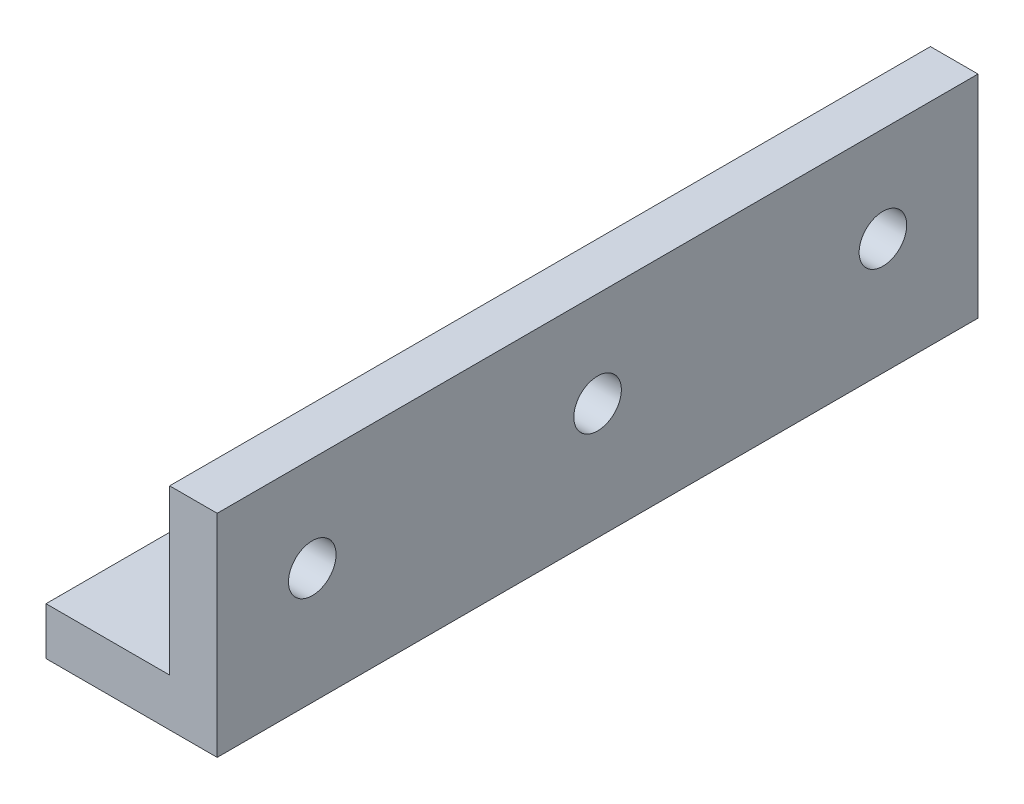
ISO-10303-21;
HEADER;
FILE_DESCRIPTION(('STEP AP214'),'2;1');
FILE_NAME('part.step','',(''),(''),'','','');
FILE_SCHEMA(('AUTOMOTIVE_DESIGN { 1 0 10303 214 1 1 1 1 }'));
ENDSEC;
DATA;
#1=APPLICATION_CONTEXT('core data for automotive mechanical design processes');
#2=APPLICATION_PROTOCOL_DEFINITION('international standard','automotive_design',2000,#1);
#3=PRODUCT_CONTEXT('',#1,'mechanical');
#4=PRODUCT('Part','Part','',(#3));
#5=PRODUCT_RELATED_PRODUCT_CATEGORY('part','',(#4));
#6=PRODUCT_DEFINITION_FORMATION('','',#4);
#7=PRODUCT_DEFINITION_CONTEXT('part definition',#1,'design');
#8=PRODUCT_DEFINITION('design','',#6,#7);
#9=PRODUCT_DEFINITION_SHAPE('','',#8);
#10=(LENGTH_UNIT() NAMED_UNIT(*) SI_UNIT(.MILLI.,.METRE.));
#11=(NAMED_UNIT(*) PLANE_ANGLE_UNIT() SI_UNIT($,.RADIAN.));
#12=(NAMED_UNIT(*) SI_UNIT($,.STERADIAN.) SOLID_ANGLE_UNIT());
#13=UNCERTAINTY_MEASURE_WITH_UNIT(LENGTH_MEASURE(1.E-05),#10,'distance_accuracy_value','');
#14=(GEOMETRIC_REPRESENTATION_CONTEXT(3) GLOBAL_UNCERTAINTY_ASSIGNED_CONTEXT((#13)) GLOBAL_UNIT_ASSIGNED_CONTEXT((#10,
#11,#12)) REPRESENTATION_CONTEXT('',''));
#15=CARTESIAN_POINT('',(0.,0.,0.));
#16=DIRECTION('',(0.,0.,1.));
#17=DIRECTION('',(1.,0.,0.));
#18=AXIS2_PLACEMENT_3D('',#15,#16,#17);
#19=CARTESIAN_POINT('',(0.,6.35,0.));
#20=DIRECTION('',(0.,-1.,0.));
#21=DIRECTION('',(0.,0.,-1.));
#22=AXIS2_PLACEMENT_3D('',#19,#20,#21);
#23=PLANE('',#22);
#24=CARTESIAN_POINT('',(24.0348534201955,6.35,10.4040716612378));
#25=DIRECTION('',(0.,1.,0.));
#26=DIRECTION('',(0.,0.,1.));
#27=AXIS2_PLACEMENT_3D('',#24,#25,#26);
#28=CIRCLE('',#27,3.175);
#29=CARTESIAN_POINT('',(24.0348534201955,6.35,13.5790716612378));
#30=VERTEX_POINT('',#29);
#31=EDGE_CURVE('E278',#30,#30,#28,.T.);
#32=ORIENTED_EDGE('',*,*,#31,.F.);
#33=EDGE_LOOP('',(#32));
#34=FACE_BOUND('',#33,.T.);
#35=CARTESIAN_POINT('',(24.0348534201955,6.35,48.5040716612378));
#36=DIRECTION('',(0.,1.,0.));
#37=DIRECTION('',(0.,0.,1.));
#38=AXIS2_PLACEMENT_3D('',#35,#36,#37);
#39=CIRCLE('',#38,3.175);
#40=CARTESIAN_POINT('',(24.0348534201955,6.35,51.6790716612378));
#41=VERTEX_POINT('',#40);
#42=EDGE_CURVE('E280',#41,#41,#39,.T.);
#43=ORIENTED_EDGE('',*,*,#42,.F.);
#44=EDGE_LOOP('',(#43));
#45=FACE_BOUND('',#44,.T.);
#46=DIRECTION('',(0.,0.,1.));
#47=VECTOR('',#46,1.);
#48=CARTESIAN_POINT('',(30.3848534201955,6.35,80.2540716612378));
#49=LINE('',#48,#47);
#50=CARTESIAN_POINT('',(30.3848534201955,6.35,-21.3459283387622));
#51=VERTEX_POINT('',#50);
#52=CARTESIAN_POINT('',(30.3848534201955,6.35,80.2540716612378));
#53=VERTEX_POINT('',#52);
#54=EDGE_CURVE('E47',#51,#53,#49,.T.);
#55=ORIENTED_EDGE('',*,*,#54,.F.);
#56=DIRECTION('',(-1.,0.,0.));
#57=VECTOR('',#56,1.);
#58=CARTESIAN_POINT('',(13.8748534201955,6.35,-21.3459283387622));
#59=LINE('',#58,#57);
#60=CARTESIAN_POINT('',(13.8748534201955,6.35,-21.3459283387622));
#61=VERTEX_POINT('',#60);
#62=EDGE_CURVE('E84',#51,#61,#59,.T.);
#63=ORIENTED_EDGE('',*,*,#62,.T.);
#64=DIRECTION('',(0.,0.,1.));
#65=VECTOR('',#64,1.);
#66=CARTESIAN_POINT('',(13.8748534201955,6.35,80.2540716612378));
#67=LINE('',#66,#65);
#68=CARTESIAN_POINT('',(13.8748534201955,6.35,80.2540716612378));
#69=VERTEX_POINT('',#68);
#70=EDGE_CURVE('E53',#61,#69,#67,.T.);
#71=ORIENTED_EDGE('',*,*,#70,.T.);
#72=DIRECTION('',(1.,0.,0.));
#73=VECTOR('',#72,1.);
#74=CARTESIAN_POINT('',(36.7348534201955,6.35,80.2540716612378));
#75=LINE('',#74,#73);
#76=EDGE_CURVE('E95',#69,#53,#75,.T.);
#77=ORIENTED_EDGE('',*,*,#76,.T.);
#78=EDGE_LOOP('',(#55,#63,#71,#77));
#79=FACE_BOUND('',#78,.T.);
#80=ADVANCED_FACE('F32',(#34,#45,#79),#23,.F.);
#81=CARTESIAN_POINT('',(13.8748534201955,6.35,-21.3459283387622));
#82=DIRECTION('',(0.,0.,1.));
#83=DIRECTION('',(1.,0.,0.));
#84=AXIS2_PLACEMENT_3D('',#81,#82,#83);
#85=PLANE('',#84);
#86=DIRECTION('',(-1.,0.,0.));
#87=VECTOR('',#86,1.);
#88=CARTESIAN_POINT('',(13.8748534201955,0.,-21.3459283387622));
#89=LINE('',#88,#87);
#90=CARTESIAN_POINT('',(36.7348534201955,0.,-21.3459283387622));
#91=VERTEX_POINT('',#90);
#92=CARTESIAN_POINT('',(13.8748534201955,0.,-21.3459283387622));
#93=VERTEX_POINT('',#92);
#94=EDGE_CURVE('E91',#91,#93,#89,.T.);
#95=ORIENTED_EDGE('',*,*,#94,.T.);
#96=DIRECTION('',(0.,-1.,0.));
#97=VECTOR('',#96,1.);
#98=CARTESIAN_POINT('',(13.8748534201955,6.35,-21.3459283387622));
#99=LINE('',#98,#97);
#100=EDGE_CURVE('E11',#61,#93,#99,.T.);
#101=ORIENTED_EDGE('',*,*,#100,.F.);
#102=ORIENTED_EDGE('',*,*,#62,.F.);
#103=DIRECTION('',(0.,-1.,0.));
#104=VECTOR('',#103,1.);
#105=CARTESIAN_POINT('',(30.3848534201955,28.23544518,-21.3459283387622));
#106=LINE('',#105,#104);
#107=CARTESIAN_POINT('',(30.3848534201955,28.23544518,-21.3459283387622));
#108=VERTEX_POINT('',#107);
#109=EDGE_CURVE('E99',#108,#51,#106,.T.);
#110=ORIENTED_EDGE('',*,*,#109,.F.);
#111=DIRECTION('',(-1.,0.,0.));
#112=VECTOR('',#111,1.);
#113=CARTESIAN_POINT('',(30.3848534201955,28.23544518,-21.3459283387622));
#114=LINE('',#113,#112);
#115=CARTESIAN_POINT('',(36.7348534201955,28.23544518,-21.3459283387622));
#116=VERTEX_POINT('',#115);
#117=EDGE_CURVE('E94',#116,#108,#114,.T.);
#118=ORIENTED_EDGE('',*,*,#117,.F.);
#119=DIRECTION('',(0.,-1.,0.));
#120=VECTOR('',#119,1.);
#121=CARTESIAN_POINT('',(36.7348534201955,6.35,-21.3459283387622));
#122=LINE('',#121,#120);
#123=EDGE_CURVE('E77',#116,#91,#122,.T.);
#124=ORIENTED_EDGE('',*,*,#123,.T.);
#125=EDGE_LOOP('',(#95,#101,#102,#110,#118,#124));
#126=FACE_BOUND('',#125,.T.);
#127=ADVANCED_FACE('F34',(#126),#85,.F.);
#128=CARTESIAN_POINT('',(13.8748534201955,6.35,80.2540716612378));
#129=DIRECTION('',(1.,0.,0.));
#130=DIRECTION('',(0.,0.,-1.));
#131=AXIS2_PLACEMENT_3D('',#128,#129,#130);
#132=PLANE('',#131);
#133=DIRECTION('',(0.,0.,1.));
#134=VECTOR('',#133,1.);
#135=CARTESIAN_POINT('',(13.8748534201955,0.,80.2540716612378));
#136=LINE('',#135,#134);
#137=CARTESIAN_POINT('',(13.8748534201955,0.,80.2540716612378));
#138=VERTEX_POINT('',#137);
#139=EDGE_CURVE('E98',#93,#138,#136,.T.);
#140=ORIENTED_EDGE('',*,*,#139,.T.);
#141=DIRECTION('',(0.,-1.,0.));
#142=VECTOR('',#141,1.);
#143=CARTESIAN_POINT('',(13.8748534201955,6.35,80.2540716612378));
#144=LINE('',#143,#142);
#145=EDGE_CURVE('E40',#69,#138,#144,.T.);
#146=ORIENTED_EDGE('',*,*,#145,.F.);
#147=ORIENTED_EDGE('',*,*,#70,.F.);
#148=ORIENTED_EDGE('',*,*,#100,.T.);
#149=EDGE_LOOP('',(#140,#146,#147,#148));
#150=FACE_BOUND('',#149,.T.);
#151=ADVANCED_FACE('F115',(#150),#132,.F.);
#152=CARTESIAN_POINT('',(36.7348534201955,6.35,80.2540716612378));
#153=DIRECTION('',(0.,0.,-1.));
#154=DIRECTION('',(-1.,0.,0.));
#155=AXIS2_PLACEMENT_3D('',#152,#153,#154);
#156=PLANE('',#155);
#157=DIRECTION('',(1.,0.,0.));
#158=VECTOR('',#157,1.);
#159=CARTESIAN_POINT('',(36.7348534201955,0.,80.2540716612378));
#160=LINE('',#159,#158);
#161=CARTESIAN_POINT('',(36.7348534201955,0.,80.2540716612378));
#162=VERTEX_POINT('',#161);
#163=EDGE_CURVE('E85',#138,#162,#160,.T.);
#164=ORIENTED_EDGE('',*,*,#163,.T.);
#165=DIRECTION('',(0.,-1.,0.));
#166=VECTOR('',#165,1.);
#167=CARTESIAN_POINT('',(36.7348534201955,6.35,80.2540716612378));
#168=LINE('',#167,#166);
#169=CARTESIAN_POINT('',(36.7348534201955,28.23544518,80.2540716612378));
#170=VERTEX_POINT('',#169);
#171=EDGE_CURVE('E80',#170,#162,#168,.T.);
#172=ORIENTED_EDGE('',*,*,#171,.F.);
#173=DIRECTION('',(1.,0.,0.));
#174=VECTOR('',#173,1.);
#175=CARTESIAN_POINT('',(36.7348534201955,28.23544518,80.2540716612378));
#176=LINE('',#175,#174);
#177=CARTESIAN_POINT('',(30.3848534201955,28.23544518,80.2540716612378));
#178=VERTEX_POINT('',#177);
#179=EDGE_CURVE('E130',#178,#170,#176,.T.);
#180=ORIENTED_EDGE('',*,*,#179,.F.);
#181=DIRECTION('',(0.,-1.,0.));
#182=VECTOR('',#181,1.);
#183=CARTESIAN_POINT('',(30.3848534201955,28.23544518,80.2540716612378));
#184=LINE('',#183,#182);
#185=EDGE_CURVE('E103',#178,#53,#184,.T.);
#186=ORIENTED_EDGE('',*,*,#185,.T.);
#187=ORIENTED_EDGE('',*,*,#76,.F.);
#188=ORIENTED_EDGE('',*,*,#145,.T.);
#189=EDGE_LOOP('',(#164,#172,#180,#186,#187,#188));
#190=FACE_BOUND('',#189,.T.);
#191=ADVANCED_FACE('F112',(#190),#156,.F.);
#192=CARTESIAN_POINT('',(36.7348534201955,6.35,-21.3459283387622));
#193=DIRECTION('',(-1.,0.,0.));
#194=DIRECTION('',(0.,0.,1.));
#195=AXIS2_PLACEMENT_3D('',#192,#193,#194);
#196=PLANE('',#195);
#197=CARTESIAN_POINT('',(36.7348534201955,15.53544518,29.4540716612378));
#198=DIRECTION('',(-1.,0.,0.));
#199=DIRECTION('',(0.,0.,1.));
#200=AXIS2_PLACEMENT_3D('',#197,#198,#199);
#201=CIRCLE('',#200,3.175);
#202=CARTESIAN_POINT('',(36.7348534201955,15.53544518,32.6290716612378));
#203=VERTEX_POINT('',#202);
#204=EDGE_CURVE('E292',#203,#203,#201,.F.);
#205=ORIENTED_EDGE('',*,*,#204,.F.);
#206=EDGE_LOOP('',(#205));
#207=FACE_BOUND('',#206,.T.);
#208=CARTESIAN_POINT('',(36.7348534201955,15.53544518,-8.64592833876222));
#209=DIRECTION('',(-1.,0.,0.));
#210=DIRECTION('',(0.,0.,1.));
#211=AXIS2_PLACEMENT_3D('',#208,#209,#210);
#212=CIRCLE('',#211,3.175);
#213=CARTESIAN_POINT('',(36.7348534201955,15.53544518,-5.47092833876222));
#214=VERTEX_POINT('',#213);
#215=EDGE_CURVE('E293',#214,#214,#212,.F.);
#216=ORIENTED_EDGE('',*,*,#215,.F.);
#217=EDGE_LOOP('',(#216));
#218=FACE_BOUND('',#217,.T.);
#219=CARTESIAN_POINT('',(36.7348534201955,15.53544518,67.5540716612378));
#220=DIRECTION('',(-1.,0.,0.));
#221=DIRECTION('',(0.,0.,1.));
#222=AXIS2_PLACEMENT_3D('',#219,#220,#221);
#223=CIRCLE('',#222,3.175);
#224=CARTESIAN_POINT('',(36.7348534201955,15.53544518,70.7290716612378));
#225=VERTEX_POINT('',#224);
#226=EDGE_CURVE('E135',#225,#225,#223,.F.);
#227=ORIENTED_EDGE('',*,*,#226,.F.);
#228=EDGE_LOOP('',(#227));
#229=FACE_BOUND('',#228,.T.);
#230=DIRECTION('',(0.,0.,-1.));
#231=VECTOR('',#230,1.);
#232=CARTESIAN_POINT('',(36.7348534201955,0.,-21.3459283387622));
#233=LINE('',#232,#231);
#234=EDGE_CURVE('E73',#162,#91,#233,.T.);
#235=ORIENTED_EDGE('',*,*,#234,.T.);
#236=ORIENTED_EDGE('',*,*,#123,.F.);
#237=DIRECTION('',(0.,0.,-1.));
#238=VECTOR('',#237,1.);
#239=CARTESIAN_POINT('',(36.7348534201955,28.23544518,-21.3459283387622));
#240=LINE('',#239,#238);
#241=EDGE_CURVE('E133',#170,#116,#240,.T.);
#242=ORIENTED_EDGE('',*,*,#241,.F.);
#243=ORIENTED_EDGE('',*,*,#171,.T.);
#244=EDGE_LOOP('',(#235,#236,#242,#243));
#245=FACE_BOUND('',#244,.T.);
#246=ADVANCED_FACE('F75',(#207,#218,#229,#245),#196,.F.);
#247=CARTESIAN_POINT('',(0.,0.,0.));
#248=DIRECTION('',(0.,-1.,0.));
#249=DIRECTION('',(0.,0.,-1.));
#250=AXIS2_PLACEMENT_3D('',#247,#248,#249);
#251=PLANE('',#250);
#252=CARTESIAN_POINT('',(24.0348534201955,0.,10.4040716612378));
#253=DIRECTION('',(0.,1.,0.));
#254=DIRECTION('',(0.,0.,1.));
#255=AXIS2_PLACEMENT_3D('',#252,#253,#254);
#256=CIRCLE('',#255,3.175);
#257=CARTESIAN_POINT('',(24.0348534201955,0.,13.5790716612378));
#258=VERTEX_POINT('',#257);
#259=EDGE_CURVE('E276',#258,#258,#256,.T.);
#260=ORIENTED_EDGE('',*,*,#259,.T.);
#261=EDGE_LOOP('',(#260));
#262=FACE_BOUND('',#261,.T.);
#263=CARTESIAN_POINT('',(24.0348534201955,0.,48.5040716612378));
#264=DIRECTION('',(0.,1.,0.));
#265=DIRECTION('',(0.,0.,1.));
#266=AXIS2_PLACEMENT_3D('',#263,#264,#265);
#267=CIRCLE('',#266,3.175);
#268=CARTESIAN_POINT('',(24.0348534201955,0.,51.6790716612378));
#269=VERTEX_POINT('',#268);
#270=EDGE_CURVE('E283',#269,#269,#267,.T.);
#271=ORIENTED_EDGE('',*,*,#270,.T.);
#272=EDGE_LOOP('',(#271));
#273=FACE_BOUND('',#272,.T.);
#274=ORIENTED_EDGE('',*,*,#94,.F.);
#275=ORIENTED_EDGE('',*,*,#234,.F.);
#276=ORIENTED_EDGE('',*,*,#163,.F.);
#277=ORIENTED_EDGE('',*,*,#139,.F.);
#278=EDGE_LOOP('',(#274,#275,#276,#277));
#279=FACE_BOUND('',#278,.T.);
#280=ADVANCED_FACE('F97',(#262,#273,#279),#251,.T.);
#281=CARTESIAN_POINT('',(30.3848534201955,28.23544518,80.2540716612378));
#282=DIRECTION('',(1.,0.,0.));
#283=DIRECTION('',(0.,0.,-1.));
#284=AXIS2_PLACEMENT_3D('',#281,#282,#283);
#285=PLANE('',#284);
#286=CARTESIAN_POINT('',(30.3848534201955,15.53544518,29.4540716612378));
#287=DIRECTION('',(-1.,0.,0.));
#288=DIRECTION('',(0.,0.,1.));
#289=AXIS2_PLACEMENT_3D('',#286,#287,#288);
#290=CIRCLE('',#289,3.175);
#291=CARTESIAN_POINT('',(30.3848534201955,15.53544518,32.6290716612378));
#292=VERTEX_POINT('',#291);
#293=EDGE_CURVE('E289',#292,#292,#290,.T.);
#294=ORIENTED_EDGE('',*,*,#293,.F.);
#295=EDGE_LOOP('',(#294));
#296=FACE_BOUND('',#295,.T.);
#297=CARTESIAN_POINT('',(30.3848534201955,15.53544518,-8.64592833876222));
#298=DIRECTION('',(-1.,0.,0.));
#299=DIRECTION('',(0.,0.,1.));
#300=AXIS2_PLACEMENT_3D('',#297,#298,#299);
#301=CIRCLE('',#300,3.175);
#302=CARTESIAN_POINT('',(30.3848534201955,15.53544518,-5.47092833876222));
#303=VERTEX_POINT('',#302);
#304=EDGE_CURVE('E286',#303,#303,#301,.T.);
#305=ORIENTED_EDGE('',*,*,#304,.F.);
#306=EDGE_LOOP('',(#305));
#307=FACE_BOUND('',#306,.T.);
#308=CARTESIAN_POINT('',(30.3848534201955,15.53544518,67.5540716612378));
#309=DIRECTION('',(-1.,0.,0.));
#310=DIRECTION('',(0.,0.,1.));
#311=AXIS2_PLACEMENT_3D('',#308,#309,#310);
#312=CIRCLE('',#311,3.175);
#313=CARTESIAN_POINT('',(30.3848534201955,15.53544518,70.7290716612378));
#314=VERTEX_POINT('',#313);
#315=EDGE_CURVE('E296',#314,#314,#312,.T.);
#316=ORIENTED_EDGE('',*,*,#315,.F.);
#317=EDGE_LOOP('',(#316));
#318=FACE_BOUND('',#317,.T.);
#319=ORIENTED_EDGE('',*,*,#54,.T.);
#320=ORIENTED_EDGE('',*,*,#185,.F.);
#321=DIRECTION('',(0.,0.,1.));
#322=VECTOR('',#321,1.);
#323=CARTESIAN_POINT('',(30.3848534201955,28.23544518,80.2540716612378));
#324=LINE('',#323,#322);
#325=EDGE_CURVE('E124',#108,#178,#324,.T.);
#326=ORIENTED_EDGE('',*,*,#325,.F.);
#327=ORIENTED_EDGE('',*,*,#109,.T.);
#328=EDGE_LOOP('',(#319,#320,#326,#327));
#329=FACE_BOUND('',#328,.T.);
#330=ADVANCED_FACE('F120',(#296,#307,#318,#329),#285,.F.);
#331=CARTESIAN_POINT('',(0.,28.23544518,0.));
#332=DIRECTION('',(0.,-1.,0.));
#333=DIRECTION('',(0.,0.,-1.));
#334=AXIS2_PLACEMENT_3D('',#331,#332,#333);
#335=PLANE('',#334);
#336=ORIENTED_EDGE('',*,*,#117,.T.);
#337=ORIENTED_EDGE('',*,*,#325,.T.);
#338=ORIENTED_EDGE('',*,*,#179,.T.);
#339=ORIENTED_EDGE('',*,*,#241,.T.);
#340=EDGE_LOOP('',(#336,#337,#338,#339));
#341=FACE_BOUND('',#340,.T.);
#342=ADVANCED_FACE('F132',(#341),#335,.F.);
#343=CARTESIAN_POINT('',(45.7151095412646,15.53544518,67.5540716612378));
#344=DIRECTION('',(-1.,0.,0.));
#345=DIRECTION('',(0.,0.,1.));
#346=AXIS2_PLACEMENT_3D('',#343,#344,#345);
#347=CYLINDRICAL_SURFACE('',#346,3.175);
#348=ORIENTED_EDGE('',*,*,#226,.T.);
#349=EDGE_LOOP('',(#348));
#350=FACE_BOUND('',#349,.T.);
#351=ORIENTED_EDGE('',*,*,#315,.T.);
#352=EDGE_LOOP('',(#351));
#353=FACE_BOUND('',#352,.T.);
#354=ADVANCED_FACE('F195',(#350,#353),#347,.F.);
#355=CARTESIAN_POINT('',(45.7151095412646,15.53544518,-8.64592833876222));
#356=DIRECTION('',(-1.,0.,0.));
#357=DIRECTION('',(0.,0.,1.));
#358=AXIS2_PLACEMENT_3D('',#355,#356,#357);
#359=CYLINDRICAL_SURFACE('',#358,3.175);
#360=ORIENTED_EDGE('',*,*,#215,.T.);
#361=EDGE_LOOP('',(#360));
#362=FACE_BOUND('',#361,.T.);
#363=ORIENTED_EDGE('',*,*,#304,.T.);
#364=EDGE_LOOP('',(#363));
#365=FACE_BOUND('',#364,.T.);
#366=ADVANCED_FACE('F200',(#362,#365),#359,.F.);
#367=CARTESIAN_POINT('',(45.7151095412646,15.53544518,29.4540716612378));
#368=DIRECTION('',(-1.,0.,0.));
#369=DIRECTION('',(0.,0.,1.));
#370=AXIS2_PLACEMENT_3D('',#367,#368,#369);
#371=CYLINDRICAL_SURFACE('',#370,3.175);
#372=ORIENTED_EDGE('',*,*,#204,.T.);
#373=EDGE_LOOP('',(#372));
#374=FACE_BOUND('',#373,.T.);
#375=ORIENTED_EDGE('',*,*,#293,.T.);
#376=EDGE_LOOP('',(#375));
#377=FACE_BOUND('',#376,.T.);
#378=ADVANCED_FACE('F208',(#374,#377),#371,.F.);
#379=CARTESIAN_POINT('',(24.0348534201955,0.,48.5040716612378));
#380=DIRECTION('',(0.,1.,0.));
#381=DIRECTION('',(0.,0.,1.));
#382=AXIS2_PLACEMENT_3D('',#379,#380,#381);
#383=CYLINDRICAL_SURFACE('',#382,3.175);
#384=ORIENTED_EDGE('',*,*,#270,.F.);
#385=EDGE_LOOP('',(#384));
#386=FACE_BOUND('',#385,.T.);
#387=ORIENTED_EDGE('',*,*,#42,.T.);
#388=EDGE_LOOP('',(#387));
#389=FACE_BOUND('',#388,.T.);
#390=ADVANCED_FACE('F216',(#386,#389),#383,.F.);
#391=CARTESIAN_POINT('',(24.0348534201955,0.,10.4040716612378));
#392=DIRECTION('',(0.,1.,0.));
#393=DIRECTION('',(0.,0.,1.));
#394=AXIS2_PLACEMENT_3D('',#391,#392,#393);
#395=CYLINDRICAL_SURFACE('',#394,3.175);
#396=ORIENTED_EDGE('',*,*,#259,.F.);
#397=EDGE_LOOP('',(#396));
#398=FACE_BOUND('',#397,.T.);
#399=ORIENTED_EDGE('',*,*,#31,.T.);
#400=EDGE_LOOP('',(#399));
#401=FACE_BOUND('',#400,.T.);
#402=ADVANCED_FACE('F223',(#398,#401),#395,.F.);
#403=CLOSED_SHELL('',(#80,#127,#151,#191,#246,#280,#330,#342,#354,#366,#378,#390,#402));
#404=MANIFOLD_SOLID_BREP('B2',#403);
#405=ADVANCED_BREP_SHAPE_REPRESENTATION('',(#18,#404),#14);
#406=SHAPE_DEFINITION_REPRESENTATION(#9,#405);
ENDSEC;
END-ISO-10303-21;
